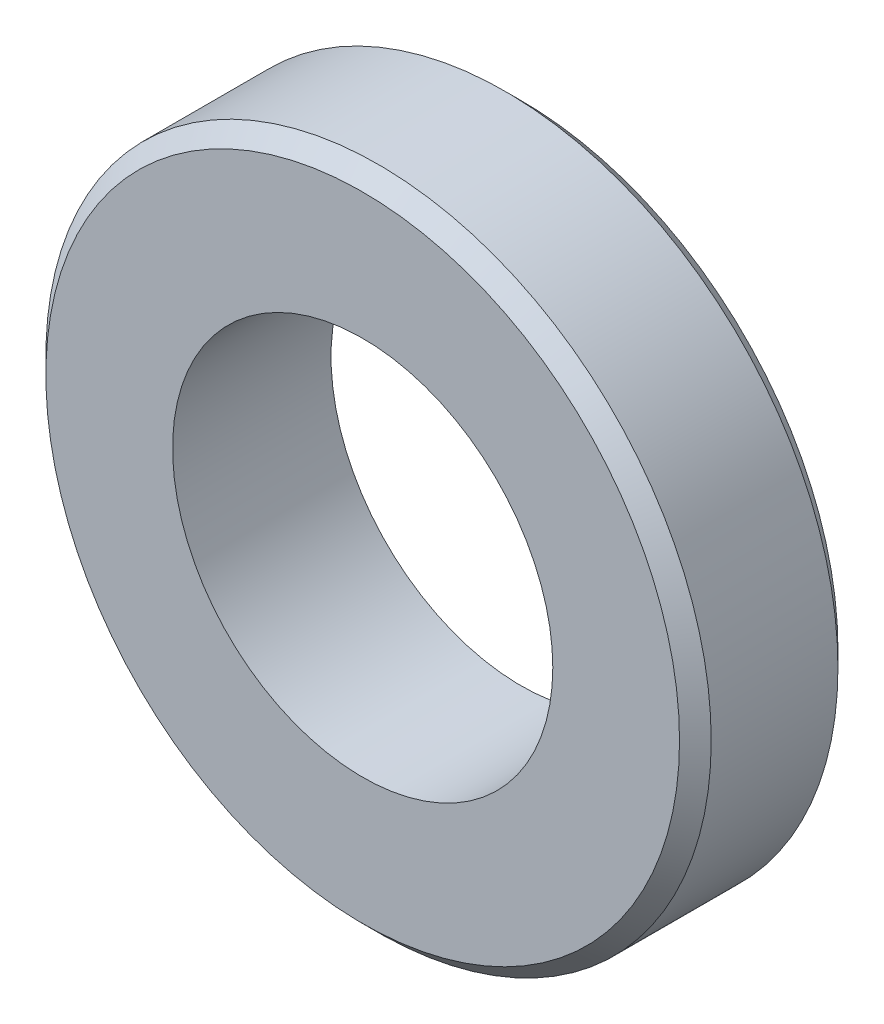
ISO-10303-21;
HEADER;
FILE_DESCRIPTION(('STEP AP214'),'2;1');
FILE_NAME('part.step','',(''),(''),'','','');
FILE_SCHEMA(('AUTOMOTIVE_DESIGN { 1 0 10303 214 1 1 1 1 }'));
ENDSEC;
DATA;
#1=APPLICATION_CONTEXT('core data for automotive mechanical design processes');
#2=APPLICATION_PROTOCOL_DEFINITION('international standard','automotive_design',2000,#1);
#3=PRODUCT_CONTEXT('',#1,'mechanical');
#4=PRODUCT('Part','Part','',(#3));
#5=PRODUCT_RELATED_PRODUCT_CATEGORY('part','',(#4));
#6=PRODUCT_DEFINITION_FORMATION('','',#4);
#7=PRODUCT_DEFINITION_CONTEXT('part definition',#1,'design');
#8=PRODUCT_DEFINITION('design','',#6,#7);
#9=PRODUCT_DEFINITION_SHAPE('','',#8);
#10=(LENGTH_UNIT() NAMED_UNIT(*) SI_UNIT(.MILLI.,.METRE.));
#11=(NAMED_UNIT(*) PLANE_ANGLE_UNIT() SI_UNIT($,.RADIAN.));
#12=(NAMED_UNIT(*) SI_UNIT($,.STERADIAN.) SOLID_ANGLE_UNIT());
#13=UNCERTAINTY_MEASURE_WITH_UNIT(LENGTH_MEASURE(1.E-05),#10,'distance_accuracy_value','');
#14=(GEOMETRIC_REPRESENTATION_CONTEXT(3) GLOBAL_UNCERTAINTY_ASSIGNED_CONTEXT((#13)) GLOBAL_UNIT_ASSIGNED_CONTEXT((#10,
#11,#12)) REPRESENTATION_CONTEXT('',''));
#15=CARTESIAN_POINT('',(0.,0.,0.));
#16=DIRECTION('',(0.,0.,1.));
#17=DIRECTION('',(1.,0.,0.));
#18=AXIS2_PLACEMENT_3D('',#15,#16,#17);
#19=CARTESIAN_POINT('',(0.,0.,5.));
#20=DIRECTION('',(0.,0.,1.));
#21=DIRECTION('',(1.,0.,0.));
#22=AXIS2_PLACEMENT_3D('',#19,#20,#21);
#23=PLANE('',#22);
#24=CARTESIAN_POINT('',(0.,0.,5.));
#25=DIRECTION('',(0.,0.,1.));
#26=DIRECTION('',(1.,0.,0.));
#27=AXIS2_PLACEMENT_3D('',#24,#25,#26);
#28=CIRCLE('',#27,10.);
#29=CARTESIAN_POINT('',(10.,0.,5.));
#30=VERTEX_POINT('',#29);
#31=EDGE_CURVE('E10',#30,#30,#28,.T.);
#32=ORIENTED_EDGE('',*,*,#31,.T.);
#33=EDGE_LOOP('',(#32));
#34=FACE_BOUND('',#33,.T.);
#35=CARTESIAN_POINT('',(0.,0.,5.));
#36=DIRECTION('',(0.,0.,1.));
#37=DIRECTION('',(1.,0.,0.));
#38=AXIS2_PLACEMENT_3D('',#35,#36,#37);
#39=CIRCLE('',#38,6.);
#40=CARTESIAN_POINT('',(6.,0.,5.));
#41=VERTEX_POINT('',#40);
#42=EDGE_CURVE('E68',#41,#41,#39,.T.);
#43=ORIENTED_EDGE('',*,*,#42,.F.);
#44=EDGE_LOOP('',(#43));
#45=FACE_BOUND('',#44,.T.);
#46=ADVANCED_FACE('F47',(#34,#45),#23,.T.);
#47=CARTESIAN_POINT('',(0.,0.,0.));
#48=DIRECTION('',(0.,0.,1.));
#49=DIRECTION('',(1.,0.,0.));
#50=AXIS2_PLACEMENT_3D('',#47,#48,#49);
#51=PLANE('',#50);
#52=CARTESIAN_POINT('',(0.,0.,0.));
#53=DIRECTION('',(0.,0.,1.));
#54=DIRECTION('',(1.,0.,0.));
#55=AXIS2_PLACEMENT_3D('',#52,#53,#54);
#56=CIRCLE('',#55,9.99999999999999);
#57=CARTESIAN_POINT('',(9.99999999999999,0.,0.));
#58=VERTEX_POINT('',#57);
#59=EDGE_CURVE('E55',#58,#58,#56,.F.);
#60=ORIENTED_EDGE('',*,*,#59,.T.);
#61=EDGE_LOOP('',(#60));
#62=FACE_BOUND('',#61,.T.);
#63=CARTESIAN_POINT('',(0.,0.,0.));
#64=DIRECTION('',(0.,0.,1.));
#65=DIRECTION('',(1.,0.,0.));
#66=AXIS2_PLACEMENT_3D('',#63,#64,#65);
#67=CIRCLE('',#66,6.);
#68=CARTESIAN_POINT('',(6.,0.,0.));
#69=VERTEX_POINT('',#68);
#70=EDGE_CURVE('E69',#69,#69,#67,.T.);
#71=ORIENTED_EDGE('',*,*,#70,.T.);
#72=EDGE_LOOP('',(#71));
#73=FACE_BOUND('',#72,.T.);
#74=ADVANCED_FACE('F79',(#62,#73),#51,.F.);
#75=CARTESIAN_POINT('',(0.,0.,5.));
#76=DIRECTION('',(0.,0.,-1.));
#77=DIRECTION('',(-1.,0.,0.));
#78=AXIS2_PLACEMENT_3D('',#75,#76,#77);
#79=CYLINDRICAL_SURFACE('',#78,10.5);
#80=CARTESIAN_POINT('',(0.,0.,0.500000000000004));
#81=DIRECTION('',(0.,0.,1.));
#82=DIRECTION('',(1.,0.,0.));
#83=AXIS2_PLACEMENT_3D('',#80,#81,#82);
#84=CIRCLE('',#83,10.5);
#85=CARTESIAN_POINT('',(10.5,0.,0.500000000000004));
#86=VERTEX_POINT('',#85);
#87=EDGE_CURVE('E59',#86,#86,#84,.T.);
#88=ORIENTED_EDGE('',*,*,#87,.T.);
#89=EDGE_LOOP('',(#88));
#90=FACE_BOUND('',#89,.T.);
#91=CARTESIAN_POINT('',(0.,0.,4.5));
#92=DIRECTION('',(0.,0.,1.));
#93=DIRECTION('',(1.,0.,0.));
#94=AXIS2_PLACEMENT_3D('',#91,#92,#93);
#95=CIRCLE('',#94,10.5);
#96=CARTESIAN_POINT('',(10.5,0.,4.5));
#97=VERTEX_POINT('',#96);
#98=EDGE_CURVE('E63',#97,#97,#95,.F.);
#99=ORIENTED_EDGE('',*,*,#98,.T.);
#100=EDGE_LOOP('',(#99));
#101=FACE_BOUND('',#100,.T.);
#102=ADVANCED_FACE('F84',(#90,#101),#79,.T.);
#103=CARTESIAN_POINT('',(0.,0.,5.));
#104=DIRECTION('',(0.,0.,-1.));
#105=DIRECTION('',(-1.,0.,0.));
#106=AXIS2_PLACEMENT_3D('',#103,#104,#105);
#107=CYLINDRICAL_SURFACE('',#106,6.);
#108=ORIENTED_EDGE('',*,*,#42,.T.);
#109=EDGE_LOOP('',(#108));
#110=FACE_BOUND('',#109,.T.);
#111=ORIENTED_EDGE('',*,*,#70,.F.);
#112=EDGE_LOOP('',(#111));
#113=FACE_BOUND('',#112,.T.);
#114=ADVANCED_FACE('F75',(#110,#113),#107,.F.);
#115=CARTESIAN_POINT('',(0.,0.,0.500000000000004));
#116=DIRECTION('',(0.,0.,1.));
#117=DIRECTION('',(1.,0.,0.));
#118=AXIS2_PLACEMENT_3D('',#115,#116,#117);
#119=CONICAL_SURFACE('',#118,10.5,0.78539816339745);
#120=ORIENTED_EDGE('',*,*,#59,.F.);
#121=EDGE_LOOP('',(#120));
#122=FACE_BOUND('',#121,.T.);
#123=ORIENTED_EDGE('',*,*,#87,.F.);
#124=EDGE_LOOP('',(#123));
#125=FACE_BOUND('',#124,.T.);
#126=ADVANCED_FACE('F91',(#122,#125),#119,.T.);
#127=CARTESIAN_POINT('',(0.,0.,5.));
#128=DIRECTION('',(0.,0.,-1.));
#129=DIRECTION('',(-1.,0.,0.));
#130=AXIS2_PLACEMENT_3D('',#127,#128,#129);
#131=CONICAL_SURFACE('',#130,10.,0.785398163397448);
#132=ORIENTED_EDGE('',*,*,#98,.F.);
#133=EDGE_LOOP('',(#132));
#134=FACE_BOUND('',#133,.T.);
#135=ORIENTED_EDGE('',*,*,#31,.F.);
#136=EDGE_LOOP('',(#135));
#137=FACE_BOUND('',#136,.T.);
#138=ADVANCED_FACE('F50',(#134,#137),#131,.T.);
#139=CLOSED_SHELL('',(#46,#74,#102,#114,#126,#138));
#140=MANIFOLD_SOLID_BREP('B2',#139);
#141=ADVANCED_BREP_SHAPE_REPRESENTATION('',(#18,#140),#14);
#142=SHAPE_DEFINITION_REPRESENTATION(#9,#141);
ENDSEC;
END-ISO-10303-21;
